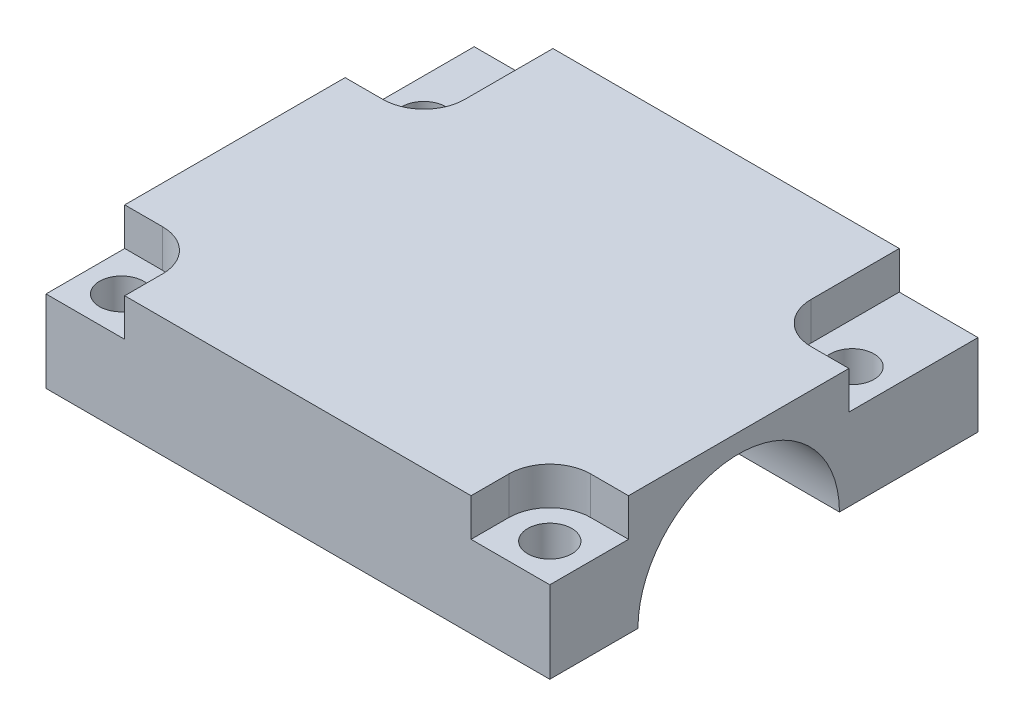
ISO-10303-21;
HEADER;
FILE_DESCRIPTION(('STEP AP214'),'2;1');
FILE_NAME('part.step','',(''),(''),'','','');
FILE_SCHEMA(('AUTOMOTIVE_DESIGN { 1 0 10303 214 1 1 1 1 }'));
ENDSEC;
DATA;
#1=APPLICATION_CONTEXT('core data for automotive mechanical design processes');
#2=APPLICATION_PROTOCOL_DEFINITION('international standard','automotive_design',2000,#1);
#3=PRODUCT_CONTEXT('',#1,'mechanical');
#4=PRODUCT('Part','Part','',(#3));
#5=PRODUCT_RELATED_PRODUCT_CATEGORY('part','',(#4));
#6=PRODUCT_DEFINITION_FORMATION('','',#4);
#7=PRODUCT_DEFINITION_CONTEXT('part definition',#1,'design');
#8=PRODUCT_DEFINITION('design','',#6,#7);
#9=PRODUCT_DEFINITION_SHAPE('','',#8);
#10=(LENGTH_UNIT() NAMED_UNIT(*) SI_UNIT(.MILLI.,.METRE.));
#11=(NAMED_UNIT(*) PLANE_ANGLE_UNIT() SI_UNIT($,.RADIAN.));
#12=(NAMED_UNIT(*) SI_UNIT($,.STERADIAN.) SOLID_ANGLE_UNIT());
#13=UNCERTAINTY_MEASURE_WITH_UNIT(LENGTH_MEASURE(1.E-05),#10,'distance_accuracy_value','');
#14=(GEOMETRIC_REPRESENTATION_CONTEXT(3) GLOBAL_UNCERTAINTY_ASSIGNED_CONTEXT((#13)) GLOBAL_UNIT_ASSIGNED_CONTEXT((#10,
#11,#12)) REPRESENTATION_CONTEXT('',''));
#15=CARTESIAN_POINT('',(0.,0.,0.));
#16=DIRECTION('',(0.,0.,1.));
#17=DIRECTION('',(1.,0.,0.));
#18=AXIS2_PLACEMENT_3D('',#15,#16,#17);
#19=CARTESIAN_POINT('',(-20.,9.5,15.));
#20=DIRECTION('',(1.,0.,0.));
#21=DIRECTION('',(0.,0.,-1.));
#22=AXIS2_PLACEMENT_3D('',#19,#20,#21);
#23=PLANE('',#22);
#24=DIRECTION('',(0.,0.,-1.));
#25=VECTOR('',#24,1.);
#26=CARTESIAN_POINT('',(-20.,6.5,-8.74999999999999));
#27=LINE('',#26,#25);
#28=CARTESIAN_POINT('',(-20.,6.5,-8.74999999999999));
#29=VERTEX_POINT('',#28);
#30=CARTESIAN_POINT('',(-20.,6.5,-19.));
#31=VERTEX_POINT('',#30);
#32=EDGE_CURVE('E389',#29,#31,#27,.T.);
#33=ORIENTED_EDGE('',*,*,#32,.T.);
#34=DIRECTION('',(0.,-1.,0.));
#35=VECTOR('',#34,1.);
#36=CARTESIAN_POINT('',(-20.,9.5,-19.));
#37=LINE('',#36,#35);
#38=CARTESIAN_POINT('',(-20.,0.,-19.));
#39=VERTEX_POINT('',#38);
#40=EDGE_CURVE('E41',#31,#39,#37,.T.);
#41=ORIENTED_EDGE('',*,*,#40,.T.);
#42=DIRECTION('',(0.,0.,1.));
#43=VECTOR('',#42,1.);
#44=CARTESIAN_POINT('',(-20.,0.,15.));
#45=LINE('',#44,#43);
#46=CARTESIAN_POINT('',(-20.,0.,-8.00000000000001));
#47=VERTEX_POINT('',#46);
#48=EDGE_CURVE('E233',#39,#47,#45,.T.);
#49=ORIENTED_EDGE('',*,*,#48,.T.);
#50=CARTESIAN_POINT('',(-20.,0.,0.));
#51=DIRECTION('',(1.,0.,0.));
#52=DIRECTION('',(0.,0.,-1.));
#53=AXIS2_PLACEMENT_3D('',#50,#51,#52);
#54=CIRCLE('',#53,8.);
#55=CARTESIAN_POINT('',(-20.,0.,8.));
#56=VERTEX_POINT('',#55);
#57=EDGE_CURVE('E326',#47,#56,#54,.T.);
#58=ORIENTED_EDGE('',*,*,#57,.T.);
#59=CARTESIAN_POINT('',(-20.,0.,15.));
#60=VERTEX_POINT('',#59);
#61=EDGE_CURVE('E232',#56,#60,#45,.T.);
#62=ORIENTED_EDGE('',*,*,#61,.T.);
#63=DIRECTION('',(0.,-1.,0.));
#64=VECTOR('',#63,1.);
#65=CARTESIAN_POINT('',(-20.,9.5,15.));
#66=LINE('',#65,#64);
#67=CARTESIAN_POINT('',(-20.,6.5,15.));
#68=VERTEX_POINT('',#67);
#69=EDGE_CURVE('E239',#68,#60,#66,.T.);
#70=ORIENTED_EDGE('',*,*,#69,.F.);
#71=DIRECTION('',(0.,0.,1.));
#72=VECTOR('',#71,1.);
#73=CARTESIAN_POINT('',(-20.,6.5,8.74999999999999));
#74=LINE('',#73,#72);
#75=CARTESIAN_POINT('',(-20.,6.5,8.74999999999999));
#76=VERTEX_POINT('',#75);
#77=EDGE_CURVE('E304',#76,#68,#74,.T.);
#78=ORIENTED_EDGE('',*,*,#77,.F.);
#79=DIRECTION('',(0.,1.,0.));
#80=VECTOR('',#79,1.);
#81=CARTESIAN_POINT('',(-20.,6.5,8.74999999999999));
#82=LINE('',#81,#80);
#83=CARTESIAN_POINT('',(-20.,9.5,8.74999999999999));
#84=VERTEX_POINT('',#83);
#85=EDGE_CURVE('E322',#76,#84,#82,.T.);
#86=ORIENTED_EDGE('',*,*,#85,.T.);
#87=DIRECTION('',(0.,0.,1.));
#88=VECTOR('',#87,1.);
#89=CARTESIAN_POINT('',(-20.,9.5,15.));
#90=LINE('',#89,#88);
#91=CARTESIAN_POINT('',(-20.,9.5,-8.74999999999999));
#92=VERTEX_POINT('',#91);
#93=EDGE_CURVE('E212',#92,#84,#90,.T.);
#94=ORIENTED_EDGE('',*,*,#93,.F.);
#95=DIRECTION('',(0.,1.,0.));
#96=VECTOR('',#95,1.);
#97=CARTESIAN_POINT('',(-20.,6.5,-8.74999999999999));
#98=LINE('',#97,#96);
#99=EDGE_CURVE('E261',#29,#92,#98,.T.);
#100=ORIENTED_EDGE('',*,*,#99,.F.);
#101=EDGE_LOOP('',(#33,#41,#49,#58,#62,#70,#78,#86,#94,#100));
#102=FACE_BOUND('',#101,.T.);
#103=ADVANCED_FACE('F32',(#102),#23,.F.);
#104=CARTESIAN_POINT('',(20.,9.5,15.));
#105=DIRECTION('',(-1.,0.,0.));
#106=DIRECTION('',(0.,0.,1.));
#107=AXIS2_PLACEMENT_3D('',#104,#105,#106);
#108=PLANE('',#107);
#109=DIRECTION('',(0.,-1.,0.));
#110=VECTOR('',#109,1.);
#111=CARTESIAN_POINT('',(20.,9.5,-19.));
#112=LINE('',#111,#110);
#113=CARTESIAN_POINT('',(20.,6.5,-19.));
#114=VERTEX_POINT('',#113);
#115=CARTESIAN_POINT('',(20.,0.,-19.));
#116=VERTEX_POINT('',#115);
#117=EDGE_CURVE('E11',#114,#116,#112,.T.);
#118=ORIENTED_EDGE('',*,*,#117,.F.);
#119=DIRECTION('',(0.,0.,-1.));
#120=VECTOR('',#119,1.);
#121=CARTESIAN_POINT('',(20.,6.5,-8.74999999999999));
#122=LINE('',#121,#120);
#123=CARTESIAN_POINT('',(20.,6.5,-8.75));
#124=VERTEX_POINT('',#123);
#125=EDGE_CURVE('E368',#124,#114,#122,.T.);
#126=ORIENTED_EDGE('',*,*,#125,.F.);
#127=DIRECTION('',(0.,1.,0.));
#128=VECTOR('',#127,1.);
#129=CARTESIAN_POINT('',(20.,6.5,-8.74999999999999));
#130=LINE('',#129,#128);
#131=CARTESIAN_POINT('',(20.,9.5,-8.74999999999999));
#132=VERTEX_POINT('',#131);
#133=EDGE_CURVE('E381',#124,#132,#130,.T.);
#134=ORIENTED_EDGE('',*,*,#133,.T.);
#135=DIRECTION('',(0.,0.,-1.));
#136=VECTOR('',#135,1.);
#137=CARTESIAN_POINT('',(20.,9.5,15.));
#138=LINE('',#137,#136);
#139=CARTESIAN_POINT('',(20.,9.5,8.74999999999999));
#140=VERTEX_POINT('',#139);
#141=EDGE_CURVE('E213',#140,#132,#138,.T.);
#142=ORIENTED_EDGE('',*,*,#141,.F.);
#143=DIRECTION('',(0.,1.,0.));
#144=VECTOR('',#143,1.);
#145=CARTESIAN_POINT('',(20.,6.5,8.74999999999999));
#146=LINE('',#145,#144);
#147=CARTESIAN_POINT('',(20.,6.5,8.74999999999999));
#148=VERTEX_POINT('',#147);
#149=EDGE_CURVE('E291',#148,#140,#146,.T.);
#150=ORIENTED_EDGE('',*,*,#149,.F.);
#151=DIRECTION('',(0.,0.,1.));
#152=VECTOR('',#151,1.);
#153=CARTESIAN_POINT('',(20.,6.5,8.74999999999999));
#154=LINE('',#153,#152);
#155=CARTESIAN_POINT('',(20.,6.5,15.));
#156=VERTEX_POINT('',#155);
#157=EDGE_CURVE('E279',#148,#156,#154,.T.);
#158=ORIENTED_EDGE('',*,*,#157,.T.);
#159=DIRECTION('',(0.,-1.,0.));
#160=VECTOR('',#159,1.);
#161=CARTESIAN_POINT('',(20.,9.5,15.));
#162=LINE('',#161,#160);
#163=CARTESIAN_POINT('',(20.,0.,15.));
#164=VERTEX_POINT('',#163);
#165=EDGE_CURVE('E224',#156,#164,#162,.T.);
#166=ORIENTED_EDGE('',*,*,#165,.T.);
#167=DIRECTION('',(0.,0.,-1.));
#168=VECTOR('',#167,1.);
#169=CARTESIAN_POINT('',(20.,0.,15.));
#170=LINE('',#169,#168);
#171=CARTESIAN_POINT('',(20.,0.,8.));
#172=VERTEX_POINT('',#171);
#173=EDGE_CURVE('E225',#164,#172,#170,.T.);
#174=ORIENTED_EDGE('',*,*,#173,.T.);
#175=CARTESIAN_POINT('',(20.,0.,0.));
#176=DIRECTION('',(1.,0.,0.));
#177=DIRECTION('',(0.,0.,-1.));
#178=AXIS2_PLACEMENT_3D('',#175,#176,#177);
#179=CIRCLE('',#178,8.);
#180=CARTESIAN_POINT('',(20.,0.,-8.00000000000001));
#181=VERTEX_POINT('',#180);
#182=EDGE_CURVE('E245',#181,#172,#179,.T.);
#183=ORIENTED_EDGE('',*,*,#182,.F.);
#184=EDGE_CURVE('E229',#181,#116,#170,.T.);
#185=ORIENTED_EDGE('',*,*,#184,.T.);
#186=EDGE_LOOP('',(#118,#126,#134,#142,#150,#158,#166,#174,#183,#185));
#187=FACE_BOUND('',#186,.T.);
#188=ADVANCED_FACE('F34',(#187),#108,.F.);
#189=CARTESIAN_POINT('',(17.,9.5,-12.));
#190=DIRECTION('',(0.,-1.,0.));
#191=DIRECTION('',(0.,0.,-1.));
#192=AXIS2_PLACEMENT_3D('',#189,#190,#191);
#193=CYLINDRICAL_SURFACE('',#192,1.75);
#194=CARTESIAN_POINT('',(17.,0.,-12.));
#195=DIRECTION('',(0.,1.,0.));
#196=DIRECTION('',(0.,0.,1.));
#197=AXIS2_PLACEMENT_3D('',#194,#195,#196);
#198=CIRCLE('',#197,1.75);
#199=CARTESIAN_POINT('',(17.,0.,-10.25));
#200=VERTEX_POINT('',#199);
#201=EDGE_CURVE('E340',#200,#200,#198,.T.);
#202=ORIENTED_EDGE('',*,*,#201,.F.);
#203=EDGE_LOOP('',(#202));
#204=FACE_BOUND('',#203,.T.);
#205=CARTESIAN_POINT('',(17.,6.5,-12.));
#206=DIRECTION('',(0.,1.,0.));
#207=DIRECTION('',(0.,0.,1.));
#208=AXIS2_PLACEMENT_3D('',#205,#206,#207);
#209=CIRCLE('',#208,1.75);
#210=CARTESIAN_POINT('',(17.,6.5,-10.25));
#211=VERTEX_POINT('',#210);
#212=EDGE_CURVE('E36',#211,#211,#209,.T.);
#213=ORIENTED_EDGE('',*,*,#212,.T.);
#214=EDGE_LOOP('',(#213));
#215=FACE_BOUND('',#214,.T.);
#216=ADVANCED_FACE('F396',(#204,#215),#193,.F.);
#217=CARTESIAN_POINT('',(0.,9.5,0.));
#218=DIRECTION('',(0.,-1.,0.));
#219=DIRECTION('',(0.,0.,-1.));
#220=AXIS2_PLACEMENT_3D('',#217,#218,#219);
#221=PLANE('',#220);
#222=DIRECTION('',(-1.,0.,0.));
#223=VECTOR('',#222,1.);
#224=CARTESIAN_POINT('',(-20.,9.5,-19.));
#225=LINE('',#224,#223);
#226=CARTESIAN_POINT('',(13.75,9.5,-19.));
#227=VERTEX_POINT('',#226);
#228=CARTESIAN_POINT('',(-13.75,9.5,-19.));
#229=VERTEX_POINT('',#228);
#230=EDGE_CURVE('E201',#227,#229,#225,.T.);
#231=ORIENTED_EDGE('',*,*,#230,.T.);
#232=DIRECTION('',(0.,0.,1.));
#233=VECTOR('',#232,1.);
#234=CARTESIAN_POINT('',(-13.75,9.5,-15.));
#235=LINE('',#234,#233);
#236=CARTESIAN_POINT('',(-13.75,9.5,-12.));
#237=VERTEX_POINT('',#236);
#238=EDGE_CURVE('E183',#229,#237,#235,.T.);
#239=ORIENTED_EDGE('',*,*,#238,.T.);
#240=CARTESIAN_POINT('',(-17.,9.5,-12.));
#241=DIRECTION('',(0.,-1.,0.));
#242=DIRECTION('',(0.,0.,-1.));
#243=AXIS2_PLACEMENT_3D('',#240,#241,#242);
#244=CIRCLE('',#243,3.25);
#245=CARTESIAN_POINT('',(-17.,9.5,-8.74999999999999));
#246=VERTEX_POINT('',#245);
#247=EDGE_CURVE('E195',#237,#246,#244,.T.);
#248=ORIENTED_EDGE('',*,*,#247,.T.);
#249=DIRECTION('',(-1.,0.,0.));
#250=VECTOR('',#249,1.);
#251=CARTESIAN_POINT('',(-17.,9.5,-8.74999999999999));
#252=LINE('',#251,#250);
#253=EDGE_CURVE('E194',#246,#92,#252,.T.);
#254=ORIENTED_EDGE('',*,*,#253,.T.);
#255=ORIENTED_EDGE('',*,*,#93,.T.);
#256=DIRECTION('',(-1.,0.,0.));
#257=VECTOR('',#256,1.);
#258=CARTESIAN_POINT('',(-17.,9.5,8.74999999999999));
#259=LINE('',#258,#257);
#260=CARTESIAN_POINT('',(-17.,9.5,8.74999999999999));
#261=VERTEX_POINT('',#260);
#262=EDGE_CURVE('E314',#261,#84,#259,.T.);
#263=ORIENTED_EDGE('',*,*,#262,.F.);
#264=CARTESIAN_POINT('',(-17.,9.5,12.));
#265=DIRECTION('',(0.,1.,0.));
#266=DIRECTION('',(0.,0.,1.));
#267=AXIS2_PLACEMENT_3D('',#264,#265,#266);
#268=CIRCLE('',#267,3.25);
#269=CARTESIAN_POINT('',(-13.75,9.5,12.));
#270=VERTEX_POINT('',#269);
#271=EDGE_CURVE('E249',#270,#261,#268,.T.);
#272=ORIENTED_EDGE('',*,*,#271,.F.);
#273=DIRECTION('',(0.,0.,-1.));
#274=VECTOR('',#273,1.);
#275=CARTESIAN_POINT('',(-13.75,9.5,15.));
#276=LINE('',#275,#274);
#277=CARTESIAN_POINT('',(-13.75,9.5,15.));
#278=VERTEX_POINT('',#277);
#279=EDGE_CURVE('E301',#278,#270,#276,.T.);
#280=ORIENTED_EDGE('',*,*,#279,.F.);
#281=DIRECTION('',(1.,0.,0.));
#282=VECTOR('',#281,1.);
#283=CARTESIAN_POINT('',(-20.,9.5,15.));
#284=LINE('',#283,#282);
#285=CARTESIAN_POINT('',(13.75,9.5,15.));
#286=VERTEX_POINT('',#285);
#287=EDGE_CURVE('E215',#278,#286,#284,.T.);
#288=ORIENTED_EDGE('',*,*,#287,.T.);
#289=DIRECTION('',(0.,0.,-1.));
#290=VECTOR('',#289,1.);
#291=CARTESIAN_POINT('',(13.75,9.5,15.));
#292=LINE('',#291,#290);
#293=CARTESIAN_POINT('',(13.75,9.5,12.));
#294=VERTEX_POINT('',#293);
#295=EDGE_CURVE('E258',#286,#294,#292,.T.);
#296=ORIENTED_EDGE('',*,*,#295,.T.);
#297=CARTESIAN_POINT('',(17.,9.5,12.));
#298=DIRECTION('',(0.,-1.,0.));
#299=DIRECTION('',(0.,0.,1.));
#300=AXIS2_PLACEMENT_3D('',#297,#298,#299);
#301=CIRCLE('',#300,3.25);
#302=CARTESIAN_POINT('',(17.,9.5,8.74999999999999));
#303=VERTEX_POINT('',#302);
#304=EDGE_CURVE('E253',#294,#303,#301,.T.);
#305=ORIENTED_EDGE('',*,*,#304,.T.);
#306=DIRECTION('',(1.,0.,0.));
#307=VECTOR('',#306,1.);
#308=CARTESIAN_POINT('',(17.,9.5,8.74999999999999));
#309=LINE('',#308,#307);
#310=EDGE_CURVE('E274',#303,#140,#309,.T.);
#311=ORIENTED_EDGE('',*,*,#310,.T.);
#312=ORIENTED_EDGE('',*,*,#141,.T.);
#313=DIRECTION('',(1.,0.,0.));
#314=VECTOR('',#313,1.);
#315=CARTESIAN_POINT('',(17.,9.5,-8.74999999999999));
#316=LINE('',#315,#314);
#317=CARTESIAN_POINT('',(17.,9.5,-8.74999999999999));
#318=VERTEX_POINT('',#317);
#319=EDGE_CURVE('E376',#318,#132,#316,.T.);
#320=ORIENTED_EDGE('',*,*,#319,.F.);
#321=CARTESIAN_POINT('',(17.,9.5,-12.));
#322=DIRECTION('',(0.,1.,0.));
#323=DIRECTION('',(0.,0.,-1.));
#324=AXIS2_PLACEMENT_3D('',#321,#322,#323);
#325=CIRCLE('',#324,3.25);
#326=CARTESIAN_POINT('',(13.75,9.5,-12.));
#327=VERTEX_POINT('',#326);
#328=EDGE_CURVE('E373',#327,#318,#325,.T.);
#329=ORIENTED_EDGE('',*,*,#328,.F.);
#330=DIRECTION('',(0.,0.,1.));
#331=VECTOR('',#330,1.);
#332=CARTESIAN_POINT('',(13.75,9.5,-15.));
#333=LINE('',#332,#331);
#334=EDGE_CURVE('E210',#227,#327,#333,.T.);
#335=ORIENTED_EDGE('',*,*,#334,.F.);
#336=EDGE_LOOP('',(#231,#239,#248,#254,#255,#263,#272,#280,#288,#296,#305,#311,#312,#320,#329,#335));
#337=FACE_BOUND('',#336,.T.);
#338=ADVANCED_FACE('F207',(#337),#221,.F.);
#339=CARTESIAN_POINT('',(-17.,9.5,-12.));
#340=DIRECTION('',(0.,-1.,0.));
#341=DIRECTION('',(0.,0.,-1.));
#342=AXIS2_PLACEMENT_3D('',#339,#340,#341);
#343=CYLINDRICAL_SURFACE('',#342,1.75);
#344=CARTESIAN_POINT('',(-17.,0.,-12.));
#345=DIRECTION('',(0.,1.,0.));
#346=DIRECTION('',(0.,0.,1.));
#347=AXIS2_PLACEMENT_3D('',#344,#345,#346);
#348=CIRCLE('',#347,1.75);
#349=CARTESIAN_POINT('',(-17.,0.,-10.25));
#350=VERTEX_POINT('',#349);
#351=EDGE_CURVE('E342',#350,#350,#348,.T.);
#352=ORIENTED_EDGE('',*,*,#351,.F.);
#353=EDGE_LOOP('',(#352));
#354=FACE_BOUND('',#353,.T.);
#355=CARTESIAN_POINT('',(-17.,6.5,-12.));
#356=DIRECTION('',(0.,1.,0.));
#357=DIRECTION('',(0.,0.,1.));
#358=AXIS2_PLACEMENT_3D('',#355,#356,#357);
#359=CIRCLE('',#358,1.75);
#360=CARTESIAN_POINT('',(-17.,6.5,-10.25));
#361=VERTEX_POINT('',#360);
#362=EDGE_CURVE('E251',#361,#361,#359,.T.);
#363=ORIENTED_EDGE('',*,*,#362,.T.);
#364=EDGE_LOOP('',(#363));
#365=FACE_BOUND('',#364,.T.);
#366=ADVANCED_FACE('F492',(#354,#365),#343,.F.);
#367=CARTESIAN_POINT('',(-20.,9.5,15.));
#368=DIRECTION('',(0.,0.,-1.));
#369=DIRECTION('',(-1.,0.,0.));
#370=AXIS2_PLACEMENT_3D('',#367,#368,#369);
#371=PLANE('',#370);
#372=DIRECTION('',(0.,1.,0.));
#373=VECTOR('',#372,1.);
#374=CARTESIAN_POINT('',(13.75,6.5,15.));
#375=LINE('',#374,#373);
#376=CARTESIAN_POINT('',(13.75,6.5,15.));
#377=VERTEX_POINT('',#376);
#378=EDGE_CURVE('E293',#377,#286,#375,.T.);
#379=ORIENTED_EDGE('',*,*,#378,.T.);
#380=ORIENTED_EDGE('',*,*,#287,.F.);
#381=DIRECTION('',(0.,1.,0.));
#382=VECTOR('',#381,1.);
#383=CARTESIAN_POINT('',(-13.75,6.5,15.));
#384=LINE('',#383,#382);
#385=CARTESIAN_POINT('',(-13.75,6.5,15.));
#386=VERTEX_POINT('',#385);
#387=EDGE_CURVE('E320',#386,#278,#384,.T.);
#388=ORIENTED_EDGE('',*,*,#387,.F.);
#389=DIRECTION('',(1.,0.,0.));
#390=VECTOR('',#389,1.);
#391=CARTESIAN_POINT('',(-20.,6.5,15.));
#392=LINE('',#391,#390);
#393=EDGE_CURVE('E306',#68,#386,#392,.T.);
#394=ORIENTED_EDGE('',*,*,#393,.F.);
#395=ORIENTED_EDGE('',*,*,#69,.T.);
#396=DIRECTION('',(1.,0.,0.));
#397=VECTOR('',#396,1.);
#398=CARTESIAN_POINT('',(-20.,0.,15.));
#399=LINE('',#398,#397);
#400=EDGE_CURVE('E218',#60,#164,#399,.T.);
#401=ORIENTED_EDGE('',*,*,#400,.T.);
#402=ORIENTED_EDGE('',*,*,#165,.F.);
#403=DIRECTION('',(-1.,0.,0.));
#404=VECTOR('',#403,1.);
#405=CARTESIAN_POINT('',(20.,6.5,15.));
#406=LINE('',#405,#404);
#407=EDGE_CURVE('E276',#156,#377,#406,.T.);
#408=ORIENTED_EDGE('',*,*,#407,.T.);
#409=EDGE_LOOP('',(#379,#380,#388,#394,#395,#401,#402,#408));
#410=FACE_BOUND('',#409,.T.);
#411=ADVANCED_FACE('F420',(#410),#371,.F.);
#412=CARTESIAN_POINT('',(17.,9.5,12.));
#413=DIRECTION('',(0.,-1.,0.));
#414=DIRECTION('',(0.,0.,-1.));
#415=AXIS2_PLACEMENT_3D('',#412,#413,#414);
#416=CYLINDRICAL_SURFACE('',#415,1.75);
#417=CARTESIAN_POINT('',(17.,0.,12.));
#418=DIRECTION('',(0.,1.,0.));
#419=DIRECTION('',(0.,0.,1.));
#420=AXIS2_PLACEMENT_3D('',#417,#418,#419);
#421=CIRCLE('',#420,1.75);
#422=CARTESIAN_POINT('',(17.,0.,13.75));
#423=VERTEX_POINT('',#422);
#424=EDGE_CURVE('E337',#423,#423,#421,.T.);
#425=ORIENTED_EDGE('',*,*,#424,.F.);
#426=EDGE_LOOP('',(#425));
#427=FACE_BOUND('',#426,.T.);
#428=CARTESIAN_POINT('',(17.,6.5,12.));
#429=DIRECTION('',(0.,1.,0.));
#430=DIRECTION('',(0.,0.,1.));
#431=AXIS2_PLACEMENT_3D('',#428,#429,#430);
#432=CIRCLE('',#431,1.75);
#433=CARTESIAN_POINT('',(17.,6.5,13.75));
#434=VERTEX_POINT('',#433);
#435=EDGE_CURVE('E247',#434,#434,#432,.T.);
#436=ORIENTED_EDGE('',*,*,#435,.T.);
#437=EDGE_LOOP('',(#436));
#438=FACE_BOUND('',#437,.T.);
#439=ADVANCED_FACE('F499',(#427,#438),#416,.F.);
#440=CARTESIAN_POINT('',(-17.,9.5,12.));
#441=DIRECTION('',(0.,-1.,0.));
#442=DIRECTION('',(0.,0.,-1.));
#443=AXIS2_PLACEMENT_3D('',#440,#441,#442);
#444=CYLINDRICAL_SURFACE('',#443,1.75);
#445=CARTESIAN_POINT('',(-17.,0.,12.));
#446=DIRECTION('',(0.,1.,0.));
#447=DIRECTION('',(0.,0.,1.));
#448=AXIS2_PLACEMENT_3D('',#445,#446,#447);
#449=CIRCLE('',#448,1.75);
#450=CARTESIAN_POINT('',(-17.,0.,13.75));
#451=VERTEX_POINT('',#450);
#452=EDGE_CURVE('E334',#451,#451,#449,.T.);
#453=ORIENTED_EDGE('',*,*,#452,.F.);
#454=EDGE_LOOP('',(#453));
#455=FACE_BOUND('',#454,.T.);
#456=CARTESIAN_POINT('',(-17.,6.5,12.));
#457=DIRECTION('',(0.,1.,0.));
#458=DIRECTION('',(0.,0.,1.));
#459=AXIS2_PLACEMENT_3D('',#456,#457,#458);
#460=CIRCLE('',#459,1.75);
#461=CARTESIAN_POINT('',(-17.,6.5,13.75));
#462=VERTEX_POINT('',#461);
#463=EDGE_CURVE('E242',#462,#462,#460,.T.);
#464=ORIENTED_EDGE('',*,*,#463,.T.);
#465=EDGE_LOOP('',(#464));
#466=FACE_BOUND('',#465,.T.);
#467=ADVANCED_FACE('F488',(#455,#466),#444,.F.);
#468=CARTESIAN_POINT('',(0.,0.,0.));
#469=DIRECTION('',(0.,-1.,0.));
#470=DIRECTION('',(0.,0.,-1.));
#471=AXIS2_PLACEMENT_3D('',#468,#469,#470);
#472=PLANE('',#471);
#473=DIRECTION('',(1.,0.,0.));
#474=VECTOR('',#473,1.);
#475=CARTESIAN_POINT('',(-20.,0.,-8.00000000000001));
#476=LINE('',#475,#474);
#477=EDGE_CURVE('E332',#47,#181,#476,.T.);
#478=ORIENTED_EDGE('',*,*,#477,.F.);
#479=ORIENTED_EDGE('',*,*,#48,.F.);
#480=DIRECTION('',(-1.,0.,0.));
#481=VECTOR('',#480,1.);
#482=CARTESIAN_POINT('',(-20.,0.,-19.));
#483=LINE('',#482,#481);
#484=EDGE_CURVE('E228',#116,#39,#483,.T.);
#485=ORIENTED_EDGE('',*,*,#484,.F.);
#486=ORIENTED_EDGE('',*,*,#184,.F.);
#487=EDGE_LOOP('',(#478,#479,#485,#486));
#488=FACE_BOUND('',#487,.T.);
#489=ORIENTED_EDGE('',*,*,#201,.T.);
#490=EDGE_LOOP('',(#489));
#491=FACE_BOUND('',#490,.T.);
#492=ORIENTED_EDGE('',*,*,#351,.T.);
#493=EDGE_LOOP('',(#492));
#494=FACE_BOUND('',#493,.T.);
#495=ADVANCED_FACE('F356',(#488,#491,#494),#472,.T.);
#496=DIRECTION('',(1.,0.,0.));
#497=VECTOR('',#496,1.);
#498=CARTESIAN_POINT('',(-20.,0.,8.));
#499=LINE('',#498,#497);
#500=EDGE_CURVE('E329',#172,#56,#499,.F.);
#501=ORIENTED_EDGE('',*,*,#500,.F.);
#502=ORIENTED_EDGE('',*,*,#173,.F.);
#503=ORIENTED_EDGE('',*,*,#400,.F.);
#504=ORIENTED_EDGE('',*,*,#61,.F.);
#505=EDGE_LOOP('',(#501,#502,#503,#504));
#506=FACE_BOUND('',#505,.T.);
#507=ORIENTED_EDGE('',*,*,#424,.T.);
#508=EDGE_LOOP('',(#507));
#509=FACE_BOUND('',#508,.T.);
#510=ORIENTED_EDGE('',*,*,#452,.T.);
#511=EDGE_LOOP('',(#510));
#512=FACE_BOUND('',#511,.T.);
#513=ADVANCED_FACE('F429',(#506,#509,#512),#472,.T.);
#514=CARTESIAN_POINT('',(-20.,9.5,-19.));
#515=DIRECTION('',(0.,0.,1.));
#516=DIRECTION('',(1.,0.,0.));
#517=AXIS2_PLACEMENT_3D('',#514,#515,#516);
#518=PLANE('',#517);
#519=DIRECTION('',(1.,0.,0.));
#520=VECTOR('',#519,1.);
#521=CARTESIAN_POINT('',(-20.,6.5,-19.));
#522=LINE('',#521,#520);
#523=CARTESIAN_POINT('',(-13.75,6.5,-19.));
#524=VERTEX_POINT('',#523);
#525=EDGE_CURVE('E204',#31,#524,#522,.T.);
#526=ORIENTED_EDGE('',*,*,#525,.T.);
#527=DIRECTION('',(0.,1.,0.));
#528=VECTOR('',#527,1.);
#529=CARTESIAN_POINT('',(-13.75,-0.920411039827929,-19.));
#530=LINE('',#529,#528);
#531=EDGE_CURVE('E186',#524,#229,#530,.T.);
#532=ORIENTED_EDGE('',*,*,#531,.T.);
#533=ORIENTED_EDGE('',*,*,#230,.F.);
#534=DIRECTION('',(0.,1.,0.));
#535=VECTOR('',#534,1.);
#536=CARTESIAN_POINT('',(13.75,-0.920411039827929,-19.));
#537=LINE('',#536,#535);
#538=CARTESIAN_POINT('',(13.75,6.5,-19.));
#539=VERTEX_POINT('',#538);
#540=EDGE_CURVE('E360',#539,#227,#537,.T.);
#541=ORIENTED_EDGE('',*,*,#540,.F.);
#542=DIRECTION('',(1.,0.,0.));
#543=VECTOR('',#542,1.);
#544=CARTESIAN_POINT('',(20.,6.5,-19.));
#545=LINE('',#544,#543);
#546=EDGE_CURVE('E205',#539,#114,#545,.T.);
#547=ORIENTED_EDGE('',*,*,#546,.T.);
#548=ORIENTED_EDGE('',*,*,#117,.T.);
#549=ORIENTED_EDGE('',*,*,#484,.T.);
#550=ORIENTED_EDGE('',*,*,#40,.F.);
#551=EDGE_LOOP('',(#526,#532,#533,#541,#547,#548,#549,#550));
#552=FACE_BOUND('',#551,.T.);
#553=ADVANCED_FACE('F199',(#552),#518,.F.);
#554=CARTESIAN_POINT('',(-20.,0.,0.));
#555=DIRECTION('',(1.,0.,0.));
#556=DIRECTION('',(0.,0.,-1.));
#557=AXIS2_PLACEMENT_3D('',#554,#555,#556);
#558=CYLINDRICAL_SURFACE('',#557,8.);
#559=ORIENTED_EDGE('',*,*,#477,.T.);
#560=ORIENTED_EDGE('',*,*,#182,.T.);
#561=ORIENTED_EDGE('',*,*,#500,.T.);
#562=ORIENTED_EDGE('',*,*,#57,.F.);
#563=EDGE_LOOP('',(#559,#560,#561,#562));
#564=FACE_BOUND('',#563,.T.);
#565=ADVANCED_FACE('F432',(#564),#558,.F.);
#566=CARTESIAN_POINT('',(-17.,6.5,12.));
#567=DIRECTION('',(0.,1.,0.));
#568=DIRECTION('',(0.,0.,1.));
#569=AXIS2_PLACEMENT_3D('',#566,#567,#568);
#570=CYLINDRICAL_SURFACE('',#569,3.25);
#571=ORIENTED_EDGE('',*,*,#271,.T.);
#572=DIRECTION('',(0.,1.,0.));
#573=VECTOR('',#572,1.);
#574=CARTESIAN_POINT('',(-17.,6.5,8.74999999999999));
#575=LINE('',#574,#573);
#576=CARTESIAN_POINT('',(-17.,6.5,8.74999999999999));
#577=VERTEX_POINT('',#576);
#578=EDGE_CURVE('E311',#577,#261,#575,.T.);
#579=ORIENTED_EDGE('',*,*,#578,.F.);
#580=CARTESIAN_POINT('',(-17.,6.5,12.));
#581=DIRECTION('',(0.,1.,0.));
#582=DIRECTION('',(0.,0.,1.));
#583=AXIS2_PLACEMENT_3D('',#580,#581,#582);
#584=CIRCLE('',#583,3.25);
#585=CARTESIAN_POINT('',(-13.75,6.5,12.));
#586=VERTEX_POINT('',#585);
#587=EDGE_CURVE('E297',#586,#577,#584,.T.);
#588=ORIENTED_EDGE('',*,*,#587,.F.);
#589=DIRECTION('',(0.,1.,0.));
#590=VECTOR('',#589,1.);
#591=CARTESIAN_POINT('',(-13.75,6.5,12.));
#592=LINE('',#591,#590);
#593=EDGE_CURVE('E246',#586,#270,#592,.T.);
#594=ORIENTED_EDGE('',*,*,#593,.T.);
#595=EDGE_LOOP('',(#571,#579,#588,#594));
#596=FACE_BOUND('',#595,.T.);
#597=ADVANCED_FACE('F454',(#596),#570,.F.);
#598=CARTESIAN_POINT('',(-13.75,6.5,15.));
#599=DIRECTION('',(1.,0.,0.));
#600=DIRECTION('',(0.,0.,-1.));
#601=AXIS2_PLACEMENT_3D('',#598,#599,#600);
#602=PLANE('',#601);
#603=ORIENTED_EDGE('',*,*,#279,.T.);
#604=ORIENTED_EDGE('',*,*,#593,.F.);
#605=DIRECTION('',(0.,0.,-1.));
#606=VECTOR('',#605,1.);
#607=CARTESIAN_POINT('',(-13.75,6.5,15.));
#608=LINE('',#607,#606);
#609=EDGE_CURVE('E308',#386,#586,#608,.T.);
#610=ORIENTED_EDGE('',*,*,#609,.F.);
#611=ORIENTED_EDGE('',*,*,#387,.T.);
#612=EDGE_LOOP('',(#603,#604,#610,#611));
#613=FACE_BOUND('',#612,.T.);
#614=ADVANCED_FACE('F508',(#613),#602,.F.);
#615=CARTESIAN_POINT('',(-17.,6.5,8.74999999999999));
#616=DIRECTION('',(0.,0.,-1.));
#617=DIRECTION('',(-1.,0.,0.));
#618=AXIS2_PLACEMENT_3D('',#615,#616,#617);
#619=PLANE('',#618);
#620=ORIENTED_EDGE('',*,*,#262,.T.);
#621=ORIENTED_EDGE('',*,*,#85,.F.);
#622=DIRECTION('',(-1.,0.,0.));
#623=VECTOR('',#622,1.);
#624=CARTESIAN_POINT('',(-17.,6.5,8.74999999999999));
#625=LINE('',#624,#623);
#626=EDGE_CURVE('E300',#577,#76,#625,.T.);
#627=ORIENTED_EDGE('',*,*,#626,.F.);
#628=ORIENTED_EDGE('',*,*,#578,.T.);
#629=EDGE_LOOP('',(#620,#621,#627,#628));
#630=FACE_BOUND('',#629,.T.);
#631=ADVANCED_FACE('F448',(#630),#619,.F.);
#632=CARTESIAN_POINT('',(-17.,6.5,12.));
#633=DIRECTION('',(0.,1.,0.));
#634=DIRECTION('',(0.,0.,1.));
#635=AXIS2_PLACEMENT_3D('',#632,#633,#634);
#636=PLANE('',#635);
#637=ORIENTED_EDGE('',*,*,#463,.F.);
#638=EDGE_LOOP('',(#637));
#639=FACE_BOUND('',#638,.T.);
#640=ORIENTED_EDGE('',*,*,#587,.T.);
#641=ORIENTED_EDGE('',*,*,#626,.T.);
#642=ORIENTED_EDGE('',*,*,#77,.T.);
#643=ORIENTED_EDGE('',*,*,#393,.T.);
#644=ORIENTED_EDGE('',*,*,#609,.T.);
#645=EDGE_LOOP('',(#640,#641,#642,#643,#644));
#646=FACE_BOUND('',#645,.T.);
#647=ADVANCED_FACE('F450',(#639,#646),#636,.T.);
#648=CARTESIAN_POINT('',(17.,6.5,12.));
#649=DIRECTION('',(0.,1.,0.));
#650=DIRECTION('',(0.,0.,1.));
#651=AXIS2_PLACEMENT_3D('',#648,#649,#650);
#652=CYLINDRICAL_SURFACE('',#651,3.25);
#653=ORIENTED_EDGE('',*,*,#304,.F.);
#654=DIRECTION('',(0.,1.,0.));
#655=VECTOR('',#654,1.);
#656=CARTESIAN_POINT('',(13.75,6.5,12.));
#657=LINE('',#656,#655);
#658=CARTESIAN_POINT('',(13.75,6.5,12.));
#659=VERTEX_POINT('',#658);
#660=EDGE_CURVE('E283',#659,#294,#657,.T.);
#661=ORIENTED_EDGE('',*,*,#660,.F.);
#662=CARTESIAN_POINT('',(17.,6.5,12.));
#663=DIRECTION('',(0.,-1.,0.));
#664=DIRECTION('',(0.,0.,1.));
#665=AXIS2_PLACEMENT_3D('',#662,#663,#664);
#666=CIRCLE('',#665,3.25);
#667=CARTESIAN_POINT('',(17.,6.5,8.74999999999999));
#668=VERTEX_POINT('',#667);
#669=EDGE_CURVE('E271',#659,#668,#666,.T.);
#670=ORIENTED_EDGE('',*,*,#669,.T.);
#671=DIRECTION('',(0.,1.,0.));
#672=VECTOR('',#671,1.);
#673=CARTESIAN_POINT('',(17.,6.5,8.74999999999999));
#674=LINE('',#673,#672);
#675=EDGE_CURVE('E250',#668,#303,#674,.T.);
#676=ORIENTED_EDGE('',*,*,#675,.T.);
#677=EDGE_LOOP('',(#653,#661,#670,#676));
#678=FACE_BOUND('',#677,.T.);
#679=ADVANCED_FACE('F414',(#678),#652,.F.);
#680=CARTESIAN_POINT('',(17.,6.5,8.74999999999999));
#681=DIRECTION('',(0.,0.,1.));
#682=DIRECTION('',(1.,0.,0.));
#683=AXIS2_PLACEMENT_3D('',#680,#681,#682);
#684=PLANE('',#683);
#685=ORIENTED_EDGE('',*,*,#310,.F.);
#686=ORIENTED_EDGE('',*,*,#675,.F.);
#687=DIRECTION('',(1.,0.,0.));
#688=VECTOR('',#687,1.);
#689=CARTESIAN_POINT('',(17.,6.5,8.74999999999999));
#690=LINE('',#689,#688);
#691=EDGE_CURVE('E282',#668,#148,#690,.T.);
#692=ORIENTED_EDGE('',*,*,#691,.T.);
#693=ORIENTED_EDGE('',*,*,#149,.T.);
#694=EDGE_LOOP('',(#685,#686,#692,#693));
#695=FACE_BOUND('',#694,.T.);
#696=ADVANCED_FACE('F412',(#695),#684,.T.);
#697=CARTESIAN_POINT('',(13.75,6.5,15.));
#698=DIRECTION('',(1.,0.,0.));
#699=DIRECTION('',(0.,0.,-1.));
#700=AXIS2_PLACEMENT_3D('',#697,#698,#699);
#701=PLANE('',#700);
#702=ORIENTED_EDGE('',*,*,#295,.F.);
#703=ORIENTED_EDGE('',*,*,#378,.F.);
#704=DIRECTION('',(0.,0.,-1.));
#705=VECTOR('',#704,1.);
#706=CARTESIAN_POINT('',(13.75,6.5,15.));
#707=LINE('',#706,#705);
#708=EDGE_CURVE('E57',#377,#659,#707,.T.);
#709=ORIENTED_EDGE('',*,*,#708,.T.);
#710=ORIENTED_EDGE('',*,*,#660,.T.);
#711=EDGE_LOOP('',(#702,#703,#709,#710));
#712=FACE_BOUND('',#711,.T.);
#713=ADVANCED_FACE('F461',(#712),#701,.T.);
#714=CARTESIAN_POINT('',(17.,6.5,12.));
#715=DIRECTION('',(0.,1.,0.));
#716=DIRECTION('',(0.,0.,1.));
#717=AXIS2_PLACEMENT_3D('',#714,#715,#716);
#718=PLANE('',#717);
#719=ORIENTED_EDGE('',*,*,#435,.F.);
#720=EDGE_LOOP('',(#719));
#721=FACE_BOUND('',#720,.T.);
#722=ORIENTED_EDGE('',*,*,#669,.F.);
#723=ORIENTED_EDGE('',*,*,#708,.F.);
#724=ORIENTED_EDGE('',*,*,#407,.F.);
#725=ORIENTED_EDGE('',*,*,#157,.F.);
#726=ORIENTED_EDGE('',*,*,#691,.F.);
#727=EDGE_LOOP('',(#722,#723,#724,#725,#726));
#728=FACE_BOUND('',#727,.T.);
#729=ADVANCED_FACE('F416',(#721,#728),#718,.T.);
#730=CARTESIAN_POINT('',(-17.,6.5,-12.));
#731=DIRECTION('',(0.,1.,0.));
#732=DIRECTION('',(0.,0.,1.));
#733=AXIS2_PLACEMENT_3D('',#730,#731,#732);
#734=CYLINDRICAL_SURFACE('',#733,3.25);
#735=ORIENTED_EDGE('',*,*,#247,.F.);
#736=DIRECTION('',(0.,1.,0.));
#737=VECTOR('',#736,1.);
#738=CARTESIAN_POINT('',(-13.75,6.5,-12.));
#739=LINE('',#738,#737);
#740=CARTESIAN_POINT('',(-13.75,6.5,-12.));
#741=VERTEX_POINT('',#740);
#742=EDGE_CURVE('E189',#741,#237,#739,.T.);
#743=ORIENTED_EDGE('',*,*,#742,.F.);
#744=CARTESIAN_POINT('',(-17.,6.5,-12.));
#745=DIRECTION('',(0.,-1.,0.));
#746=DIRECTION('',(0.,0.,-1.));
#747=AXIS2_PLACEMENT_3D('',#744,#745,#746);
#748=CIRCLE('',#747,3.25);
#749=CARTESIAN_POINT('',(-17.,6.5,-8.74999999999999));
#750=VERTEX_POINT('',#749);
#751=EDGE_CURVE('E385',#741,#750,#748,.T.);
#752=ORIENTED_EDGE('',*,*,#751,.T.);
#753=DIRECTION('',(0.,1.,0.));
#754=VECTOR('',#753,1.);
#755=CARTESIAN_POINT('',(-17.,6.5,-8.74999999999999));
#756=LINE('',#755,#754);
#757=EDGE_CURVE('E254',#750,#246,#756,.T.);
#758=ORIENTED_EDGE('',*,*,#757,.T.);
#759=EDGE_LOOP('',(#735,#743,#752,#758));
#760=FACE_BOUND('',#759,.T.);
#761=ADVANCED_FACE('F441',(#760),#734,.F.);
#762=CARTESIAN_POINT('',(-17.,6.5,-8.74999999999999));
#763=DIRECTION('',(0.,0.,-1.));
#764=DIRECTION('',(-1.,0.,0.));
#765=AXIS2_PLACEMENT_3D('',#762,#763,#764);
#766=PLANE('',#765);
#767=ORIENTED_EDGE('',*,*,#253,.F.);
#768=ORIENTED_EDGE('',*,*,#757,.F.);
#769=DIRECTION('',(-1.,0.,0.));
#770=VECTOR('',#769,1.);
#771=CARTESIAN_POINT('',(-17.,6.5,-8.74999999999999));
#772=LINE('',#771,#770);
#773=EDGE_CURVE('E270',#750,#29,#772,.T.);
#774=ORIENTED_EDGE('',*,*,#773,.T.);
#775=ORIENTED_EDGE('',*,*,#99,.T.);
#776=EDGE_LOOP('',(#767,#768,#774,#775));
#777=FACE_BOUND('',#776,.T.);
#778=ADVANCED_FACE('F443',(#777),#766,.T.);
#779=CARTESIAN_POINT('',(-13.75,6.5,-15.));
#780=DIRECTION('',(-1.,0.,0.));
#781=DIRECTION('',(0.,0.,1.));
#782=AXIS2_PLACEMENT_3D('',#779,#780,#781);
#783=PLANE('',#782);
#784=ORIENTED_EDGE('',*,*,#238,.F.);
#785=ORIENTED_EDGE('',*,*,#531,.F.);
#786=DIRECTION('',(0.,0.,1.));
#787=VECTOR('',#786,1.);
#788=CARTESIAN_POINT('',(-13.75,6.5,-15.));
#789=LINE('',#788,#787);
#790=EDGE_CURVE('E387',#524,#741,#789,.T.);
#791=ORIENTED_EDGE('',*,*,#790,.T.);
#792=ORIENTED_EDGE('',*,*,#742,.T.);
#793=EDGE_LOOP('',(#784,#785,#791,#792));
#794=FACE_BOUND('',#793,.T.);
#795=ADVANCED_FACE('F185',(#794),#783,.T.);
#796=CARTESIAN_POINT('',(-17.,6.5,-12.));
#797=DIRECTION('',(0.,1.,0.));
#798=DIRECTION('',(0.,0.,-1.));
#799=AXIS2_PLACEMENT_3D('',#796,#797,#798);
#800=PLANE('',#799);
#801=ORIENTED_EDGE('',*,*,#362,.F.);
#802=EDGE_LOOP('',(#801));
#803=FACE_BOUND('',#802,.T.);
#804=ORIENTED_EDGE('',*,*,#751,.F.);
#805=ORIENTED_EDGE('',*,*,#790,.F.);
#806=ORIENTED_EDGE('',*,*,#525,.F.);
#807=ORIENTED_EDGE('',*,*,#32,.F.);
#808=ORIENTED_EDGE('',*,*,#773,.F.);
#809=EDGE_LOOP('',(#804,#805,#806,#807,#808));
#810=FACE_BOUND('',#809,.T.);
#811=ADVANCED_FACE('F439',(#803,#810),#800,.T.);
#812=CARTESIAN_POINT('',(17.,6.5,-12.));
#813=DIRECTION('',(0.,1.,0.));
#814=DIRECTION('',(0.,0.,1.));
#815=AXIS2_PLACEMENT_3D('',#812,#813,#814);
#816=CYLINDRICAL_SURFACE('',#815,3.25);
#817=ORIENTED_EDGE('',*,*,#328,.T.);
#818=DIRECTION('',(0.,1.,0.));
#819=VECTOR('',#818,1.);
#820=CARTESIAN_POINT('',(17.,6.5,-8.74999999999999));
#821=LINE('',#820,#819);
#822=CARTESIAN_POINT('',(17.,6.5,-8.74999999999999));
#823=VERTEX_POINT('',#822);
#824=EDGE_CURVE('E372',#823,#318,#821,.T.);
#825=ORIENTED_EDGE('',*,*,#824,.F.);
#826=CARTESIAN_POINT('',(17.,6.5,-12.));
#827=DIRECTION('',(0.,1.,0.));
#828=DIRECTION('',(0.,0.,-1.));
#829=AXIS2_PLACEMENT_3D('',#826,#827,#828);
#830=CIRCLE('',#829,3.25);
#831=CARTESIAN_POINT('',(13.75,6.5,-12.));
#832=VERTEX_POINT('',#831);
#833=EDGE_CURVE('E365',#832,#823,#830,.T.);
#834=ORIENTED_EDGE('',*,*,#833,.F.);
#835=DIRECTION('',(0.,1.,0.));
#836=VECTOR('',#835,1.);
#837=CARTESIAN_POINT('',(13.75,6.5,-12.));
#838=LINE('',#837,#836);
#839=EDGE_CURVE('E379',#832,#327,#838,.T.);
#840=ORIENTED_EDGE('',*,*,#839,.T.);
#841=EDGE_LOOP('',(#817,#825,#834,#840));
#842=FACE_BOUND('',#841,.T.);
#843=ADVANCED_FACE('F404',(#842),#816,.F.);
#844=CARTESIAN_POINT('',(13.75,6.5,-15.));
#845=DIRECTION('',(-1.,0.,0.));
#846=DIRECTION('',(0.,0.,1.));
#847=AXIS2_PLACEMENT_3D('',#844,#845,#846);
#848=PLANE('',#847);
#849=ORIENTED_EDGE('',*,*,#334,.T.);
#850=ORIENTED_EDGE('',*,*,#839,.F.);
#851=DIRECTION('',(0.,0.,1.));
#852=VECTOR('',#851,1.);
#853=CARTESIAN_POINT('',(13.75,6.5,-15.));
#854=LINE('',#853,#852);
#855=EDGE_CURVE('E370',#539,#832,#854,.T.);
#856=ORIENTED_EDGE('',*,*,#855,.F.);
#857=ORIENTED_EDGE('',*,*,#540,.T.);
#858=EDGE_LOOP('',(#849,#850,#856,#857));
#859=FACE_BOUND('',#858,.T.);
#860=ADVANCED_FACE('F577',(#859),#848,.F.);
#861=CARTESIAN_POINT('',(17.,6.5,-8.74999999999999));
#862=DIRECTION('',(0.,0.,1.));
#863=DIRECTION('',(1.,0.,0.));
#864=AXIS2_PLACEMENT_3D('',#861,#862,#863);
#865=PLANE('',#864);
#866=ORIENTED_EDGE('',*,*,#319,.T.);
#867=ORIENTED_EDGE('',*,*,#133,.F.);
#868=DIRECTION('',(1.,0.,0.));
#869=VECTOR('',#868,1.);
#870=CARTESIAN_POINT('',(17.,6.5,-8.74999999999999));
#871=LINE('',#870,#869);
#872=EDGE_CURVE('E49',#823,#124,#871,.T.);
#873=ORIENTED_EDGE('',*,*,#872,.F.);
#874=ORIENTED_EDGE('',*,*,#824,.T.);
#875=EDGE_LOOP('',(#866,#867,#873,#874));
#876=FACE_BOUND('',#875,.T.);
#877=ADVANCED_FACE('F400',(#876),#865,.F.);
#878=CARTESIAN_POINT('',(17.,6.5,-12.));
#879=DIRECTION('',(0.,1.,0.));
#880=DIRECTION('',(0.,0.,-1.));
#881=AXIS2_PLACEMENT_3D('',#878,#879,#880);
#882=PLANE('',#881);
#883=ORIENTED_EDGE('',*,*,#212,.F.);
#884=EDGE_LOOP('',(#883));
#885=FACE_BOUND('',#884,.T.);
#886=ORIENTED_EDGE('',*,*,#833,.T.);
#887=ORIENTED_EDGE('',*,*,#872,.T.);
#888=ORIENTED_EDGE('',*,*,#125,.T.);
#889=ORIENTED_EDGE('',*,*,#546,.F.);
#890=ORIENTED_EDGE('',*,*,#855,.T.);
#891=EDGE_LOOP('',(#886,#887,#888,#889,#890));
#892=FACE_BOUND('',#891,.T.);
#893=ADVANCED_FACE('F398',(#885,#892),#882,.T.);
#894=CLOSED_SHELL('',(#103,#188,#216,#338,#366,#411,#439,#467,#495,#513,#553,#565,#597,#614,
#631,#647,#679,#696,#713,#729,#761,#778,#795,#811,#843,#860,#877,#893));
#895=MANIFOLD_SOLID_BREP('B2',#894);
#896=ADVANCED_BREP_SHAPE_REPRESENTATION('',(#18,#895),#14);
#897=SHAPE_DEFINITION_REPRESENTATION(#9,#896);
ENDSEC;
END-ISO-10303-21;
